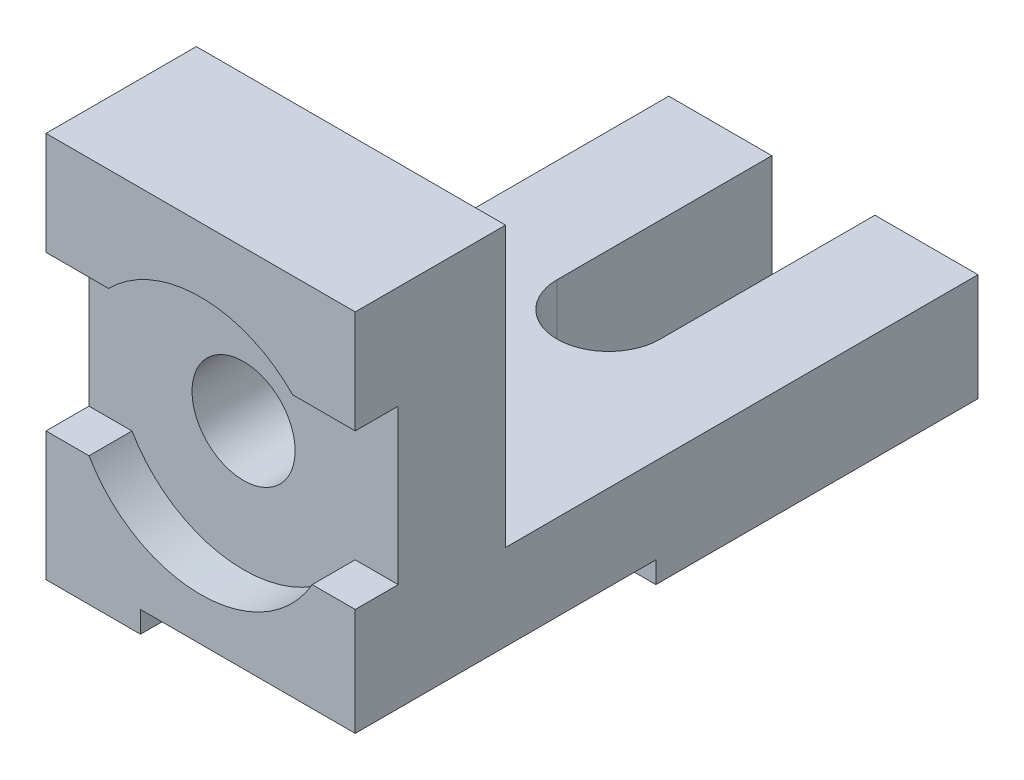
ISO-10303-21;
HEADER;
FILE_DESCRIPTION(('STEP AP214'),'2;1');
FILE_NAME('part.step','',(''),(''),'','','');
FILE_SCHEMA(('AUTOMOTIVE_DESIGN { 1 0 10303 214 1 1 1 1 }'));
ENDSEC;
DATA;
#1=APPLICATION_CONTEXT('core data for automotive mechanical design processes');
#2=APPLICATION_PROTOCOL_DEFINITION('international standard','automotive_design',2000,#1);
#3=PRODUCT_CONTEXT('',#1,'mechanical');
#4=PRODUCT('Part','Part','',(#3));
#5=PRODUCT_RELATED_PRODUCT_CATEGORY('part','',(#4));
#6=PRODUCT_DEFINITION_FORMATION('','',#4);
#7=PRODUCT_DEFINITION_CONTEXT('part definition',#1,'design');
#8=PRODUCT_DEFINITION('design','',#6,#7);
#9=PRODUCT_DEFINITION_SHAPE('','',#8);
#10=(LENGTH_UNIT() NAMED_UNIT(*) SI_UNIT(.MILLI.,.METRE.));
#11=(NAMED_UNIT(*) PLANE_ANGLE_UNIT() SI_UNIT($,.RADIAN.));
#12=(NAMED_UNIT(*) SI_UNIT($,.STERADIAN.) SOLID_ANGLE_UNIT());
#13=UNCERTAINTY_MEASURE_WITH_UNIT(LENGTH_MEASURE(1.E-05),#10,'distance_accuracy_value','');
#14=(GEOMETRIC_REPRESENTATION_CONTEXT(3) GLOBAL_UNCERTAINTY_ASSIGNED_CONTEXT((#13)) GLOBAL_UNIT_ASSIGNED_CONTEXT((#10,
#11,#12)) REPRESENTATION_CONTEXT('',''));
#15=CARTESIAN_POINT('',(0.,0.,0.));
#16=DIRECTION('',(0.,0.,1.));
#17=DIRECTION('',(1.,0.,0.));
#18=AXIS2_PLACEMENT_3D('',#15,#16,#17);
#19=CARTESIAN_POINT('',(-72.,30.,-10.));
#20=DIRECTION('',(0.,1.,0.));
#21=DIRECTION('',(0.,0.,1.));
#22=AXIS2_PLACEMENT_3D('',#19,#20,#21);
#23=PLANE('',#22);
#24=DIRECTION('',(1.,0.,0.));
#25=VECTOR('',#24,1.);
#26=CARTESIAN_POINT('',(-72.,30.,0.));
#27=LINE('',#26,#25);
#28=CARTESIAN_POINT('',(-72.,30.,0.));
#29=VERTEX_POINT('',#28);
#30=CARTESIAN_POINT('',(-61.9807621135332,30.,0.));
#31=VERTEX_POINT('',#30);
#32=EDGE_CURVE('E11',#29,#31,#27,.T.);
#33=ORIENTED_EDGE('',*,*,#32,.T.);
#34=DIRECTION('',(0.,0.,1.));
#35=VECTOR('',#34,1.);
#36=CARTESIAN_POINT('',(-61.9807621135332,30.,-94.8528137423857));
#37=LINE('',#36,#35);
#38=CARTESIAN_POINT('',(-61.9807621135332,30.,-10.));
#39=VERTEX_POINT('',#38);
#40=EDGE_CURVE('E231',#31,#39,#37,.F.);
#41=ORIENTED_EDGE('',*,*,#40,.T.);
#42=DIRECTION('',(1.,0.,0.));
#43=VECTOR('',#42,1.);
#44=CARTESIAN_POINT('',(-72.,30.,-10.));
#45=LINE('',#44,#43);
#46=CARTESIAN_POINT('',(-72.,30.,-10.));
#47=VERTEX_POINT('',#46);
#48=EDGE_CURVE('E315',#47,#39,#45,.T.);
#49=ORIENTED_EDGE('',*,*,#48,.F.);
#50=DIRECTION('',(0.,0.,1.));
#51=VECTOR('',#50,1.);
#52=CARTESIAN_POINT('',(-72.,30.,-10.));
#53=LINE('',#52,#51);
#54=EDGE_CURVE('E287',#47,#29,#53,.T.);
#55=ORIENTED_EDGE('',*,*,#54,.T.);
#56=EDGE_LOOP('',(#33,#41,#49,#55));
#57=FACE_BOUND('',#56,.T.);
#58=ADVANCED_FACE('F37',(#57),#23,.T.);
#59=CARTESIAN_POINT('',(-10.0192378864668,30.,-10.));
#60=VERTEX_POINT('',#59);
#61=CARTESIAN_POINT('',(0.,30.,-10.));
#62=VERTEX_POINT('',#61);
#63=EDGE_CURVE('E317',#60,#62,#45,.T.);
#64=ORIENTED_EDGE('',*,*,#63,.F.);
#65=DIRECTION('',(0.,0.,1.));
#66=VECTOR('',#65,1.);
#67=CARTESIAN_POINT('',(-10.0192378864668,30.,-94.8528137423857));
#68=LINE('',#67,#66);
#69=CARTESIAN_POINT('',(-10.0192378864668,30.,0.));
#70=VERTEX_POINT('',#69);
#71=EDGE_CURVE('E228',#60,#70,#68,.T.);
#72=ORIENTED_EDGE('',*,*,#71,.T.);
#73=CARTESIAN_POINT('',(0.,30.,0.));
#74=VERTEX_POINT('',#73);
#75=EDGE_CURVE('E46',#70,#74,#27,.T.);
#76=ORIENTED_EDGE('',*,*,#75,.T.);
#77=DIRECTION('',(0.,0.,1.));
#78=VECTOR('',#77,1.);
#79=CARTESIAN_POINT('',(0.,30.,-10.));
#80=LINE('',#79,#78);
#81=EDGE_CURVE('E263',#62,#74,#80,.T.);
#82=ORIENTED_EDGE('',*,*,#81,.F.);
#83=EDGE_LOOP('',(#64,#72,#76,#82));
#84=FACE_BOUND('',#83,.T.);
#85=ADVANCED_FACE('F398',(#84),#23,.T.);
#86=CARTESIAN_POINT('',(-72.,66.,0.));
#87=DIRECTION('',(0.,-1.,0.));
#88=DIRECTION('',(0.,0.,-1.));
#89=AXIS2_PLACEMENT_3D('',#86,#87,#88);
#90=PLANE('',#89);
#91=DIRECTION('',(1.,0.,0.));
#92=VECTOR('',#91,1.);
#93=CARTESIAN_POINT('',(-72.,66.,0.));
#94=LINE('',#93,#92);
#95=CARTESIAN_POINT('',(-14.5757147143714,66.,0.));
#96=VERTEX_POINT('',#95);
#97=CARTESIAN_POINT('',(0.,66.,0.));
#98=VERTEX_POINT('',#97);
#99=EDGE_CURVE('E325',#96,#98,#94,.T.);
#100=ORIENTED_EDGE('',*,*,#99,.F.);
#101=DIRECTION('',(0.,0.,1.));
#102=VECTOR('',#101,1.);
#103=CARTESIAN_POINT('',(-14.5757147143714,66.,-94.8528137423857));
#104=LINE('',#103,#102);
#105=CARTESIAN_POINT('',(-14.5757147143714,66.,-10.));
#106=VERTEX_POINT('',#105);
#107=EDGE_CURVE('E225',#96,#106,#104,.F.);
#108=ORIENTED_EDGE('',*,*,#107,.T.);
#109=DIRECTION('',(1.,0.,0.));
#110=VECTOR('',#109,1.);
#111=CARTESIAN_POINT('',(-72.,66.,-10.));
#112=LINE('',#111,#110);
#113=CARTESIAN_POINT('',(0.,66.,-10.));
#114=VERTEX_POINT('',#113);
#115=EDGE_CURVE('E321',#106,#114,#112,.T.);
#116=ORIENTED_EDGE('',*,*,#115,.T.);
#117=DIRECTION('',(0.,0.,-1.));
#118=VECTOR('',#117,1.);
#119=CARTESIAN_POINT('',(0.,66.,0.));
#120=LINE('',#119,#118);
#121=EDGE_CURVE('E308',#98,#114,#120,.T.);
#122=ORIENTED_EDGE('',*,*,#121,.F.);
#123=EDGE_LOOP('',(#100,#108,#116,#122));
#124=FACE_BOUND('',#123,.T.);
#125=ADVANCED_FACE('F390',(#124),#90,.T.);
#126=CARTESIAN_POINT('',(-72.,66.,-10.));
#127=VERTEX_POINT('',#126);
#128=CARTESIAN_POINT('',(-57.4242852856285,66.,-10.));
#129=VERTEX_POINT('',#128);
#130=EDGE_CURVE('E318',#127,#129,#112,.T.);
#131=ORIENTED_EDGE('',*,*,#130,.T.);
#132=DIRECTION('',(0.,0.,1.));
#133=VECTOR('',#132,1.);
#134=CARTESIAN_POINT('',(-57.4242852856285,66.,-94.8528137423857));
#135=LINE('',#134,#133);
#136=CARTESIAN_POINT('',(-57.4242852856285,66.,0.));
#137=VERTEX_POINT('',#136);
#138=EDGE_CURVE('E222',#129,#137,#135,.T.);
#139=ORIENTED_EDGE('',*,*,#138,.T.);
#140=CARTESIAN_POINT('',(-72.,66.,0.));
#141=VERTEX_POINT('',#140);
#142=EDGE_CURVE('E322',#141,#137,#94,.T.);
#143=ORIENTED_EDGE('',*,*,#142,.F.);
#144=DIRECTION('',(0.,0.,-1.));
#145=VECTOR('',#144,1.);
#146=CARTESIAN_POINT('',(-72.,66.,0.));
#147=LINE('',#146,#145);
#148=EDGE_CURVE('E281',#141,#127,#147,.T.);
#149=ORIENTED_EDGE('',*,*,#148,.T.);
#150=EDGE_LOOP('',(#131,#139,#143,#149));
#151=FACE_BOUND('',#150,.T.);
#152=ADVANCED_FACE('F433',(#151),#90,.T.);
#153=CARTESIAN_POINT('',(-72.,0.,-145.));
#154=DIRECTION('',(0.,0.,-1.));
#155=DIRECTION('',(-1.,0.,0.));
#156=AXIS2_PLACEMENT_3D('',#153,#154,#155);
#157=PLANE('',#156);
#158=DIRECTION('',(1.,0.,0.));
#159=VECTOR('',#158,1.);
#160=CARTESIAN_POINT('',(-72.,25.,-145.));
#161=LINE('',#160,#159);
#162=CARTESIAN_POINT('',(-72.,25.,-145.));
#163=VERTEX_POINT('',#162);
#164=CARTESIAN_POINT('',(-48.,25.,-145.));
#165=VERTEX_POINT('',#164);
#166=EDGE_CURVE('E332',#163,#165,#161,.T.);
#167=ORIENTED_EDGE('',*,*,#166,.T.);
#168=DIRECTION('',(0.,-1.,0.));
#169=VECTOR('',#168,1.);
#170=CARTESIAN_POINT('',(-48.,262.783609871224,-145.));
#171=LINE('',#170,#169);
#172=CARTESIAN_POINT('',(-48.,0.,-145.));
#173=VERTEX_POINT('',#172);
#174=EDGE_CURVE('E255',#165,#173,#171,.T.);
#175=ORIENTED_EDGE('',*,*,#174,.T.);
#176=DIRECTION('',(1.,0.,0.));
#177=VECTOR('',#176,1.);
#178=CARTESIAN_POINT('',(-72.,0.,-145.));
#179=LINE('',#178,#177);
#180=CARTESIAN_POINT('',(-72.,0.,-145.));
#181=VERTEX_POINT('',#180);
#182=EDGE_CURVE('E335',#181,#173,#179,.T.);
#183=ORIENTED_EDGE('',*,*,#182,.F.);
#184=DIRECTION('',(0.,1.,0.));
#185=VECTOR('',#184,1.);
#186=CARTESIAN_POINT('',(-72.,0.,-145.));
#187=LINE('',#186,#185);
#188=EDGE_CURVE('E266',#181,#163,#187,.T.);
#189=ORIENTED_EDGE('',*,*,#188,.T.);
#190=EDGE_LOOP('',(#167,#175,#183,#189));
#191=FACE_BOUND('',#190,.T.);
#192=ADVANCED_FACE('F356',(#191),#157,.T.);
#193=CARTESIAN_POINT('',(-72.,25.,-145.));
#194=DIRECTION('',(0.,1.,0.));
#195=DIRECTION('',(0.,0.,1.));
#196=AXIS2_PLACEMENT_3D('',#193,#194,#195);
#197=PLANE('',#196);
#198=DIRECTION('',(0.,0.,1.));
#199=VECTOR('',#198,1.);
#200=CARTESIAN_POINT('',(-48.,25.,-145.));
#201=LINE('',#200,#199);
#202=CARTESIAN_POINT('',(-48.,25.,-95.));
#203=VERTEX_POINT('',#202);
#204=EDGE_CURVE('E238',#165,#203,#201,.T.);
#205=ORIENTED_EDGE('',*,*,#204,.F.);
#206=ORIENTED_EDGE('',*,*,#166,.F.);
#207=DIRECTION('',(0.,0.,1.));
#208=VECTOR('',#207,1.);
#209=CARTESIAN_POINT('',(-72.,25.,-145.));
#210=LINE('',#209,#208);
#211=CARTESIAN_POINT('',(-72.,25.,-35.));
#212=VERTEX_POINT('',#211);
#213=EDGE_CURVE('E269',#163,#212,#210,.T.);
#214=ORIENTED_EDGE('',*,*,#213,.T.);
#215=DIRECTION('',(1.,0.,0.));
#216=VECTOR('',#215,1.);
#217=CARTESIAN_POINT('',(-72.,25.,-35.));
#218=LINE('',#217,#216);
#219=CARTESIAN_POINT('',(0.,25.,-35.));
#220=VERTEX_POINT('',#219);
#221=EDGE_CURVE('E330',#212,#220,#218,.T.);
#222=ORIENTED_EDGE('',*,*,#221,.T.);
#223=DIRECTION('',(0.,0.,1.));
#224=VECTOR('',#223,1.);
#225=CARTESIAN_POINT('',(0.,25.,-145.));
#226=LINE('',#225,#224);
#227=CARTESIAN_POINT('',(0.,25.,-145.));
#228=VERTEX_POINT('',#227);
#229=EDGE_CURVE('E296',#228,#220,#226,.T.);
#230=ORIENTED_EDGE('',*,*,#229,.F.);
#231=CARTESIAN_POINT('',(-24.,25.,-145.));
#232=VERTEX_POINT('',#231);
#233=EDGE_CURVE('E334',#232,#228,#161,.T.);
#234=ORIENTED_EDGE('',*,*,#233,.F.);
#235=DIRECTION('',(0.,0.,-1.));
#236=VECTOR('',#235,1.);
#237=CARTESIAN_POINT('',(-24.,25.,-145.));
#238=LINE('',#237,#236);
#239=CARTESIAN_POINT('',(-24.,25.,-95.));
#240=VERTEX_POINT('',#239);
#241=EDGE_CURVE('E237',#240,#232,#238,.T.);
#242=ORIENTED_EDGE('',*,*,#241,.F.);
#243=CARTESIAN_POINT('',(-36.,25.,-95.));
#244=DIRECTION('',(0.,1.,0.));
#245=DIRECTION('',(0.,0.,1.));
#246=AXIS2_PLACEMENT_3D('',#243,#244,#245);
#247=CIRCLE('',#246,12.);
#248=EDGE_CURVE('E235',#203,#240,#247,.T.);
#249=ORIENTED_EDGE('',*,*,#248,.F.);
#250=EDGE_LOOP('',(#205,#206,#214,#222,#230,#234,#242,#249));
#251=FACE_BOUND('',#250,.T.);
#252=ADVANCED_FACE('F363',(#251),#197,.T.);
#253=CARTESIAN_POINT('',(-72.,30.,0.));
#254=DIRECTION('',(0.,0.,1.));
#255=DIRECTION('',(0.,-1.,0.));
#256=AXIS2_PLACEMENT_3D('',#253,#254,#255);
#257=PLANE('',#256);
#258=DIRECTION('',(0.,-1.,0.));
#259=VECTOR('',#258,1.);
#260=CARTESIAN_POINT('',(-50.,5.,0.));
#261=LINE('',#260,#259);
#262=CARTESIAN_POINT('',(-50.,5.,0.));
#263=VERTEX_POINT('',#262);
#264=CARTESIAN_POINT('',(-50.,0.,0.));
#265=VERTEX_POINT('',#264);
#266=EDGE_CURVE('E197',#263,#265,#261,.T.);
#267=ORIENTED_EDGE('',*,*,#266,.F.);
#268=DIRECTION('',(-1.,0.,0.));
#269=VECTOR('',#268,1.);
#270=CARTESIAN_POINT('',(0.,5.,0.));
#271=LINE('',#270,#269);
#272=CARTESIAN_POINT('',(0.,5.,0.));
#273=VERTEX_POINT('',#272);
#274=EDGE_CURVE('E401',#273,#263,#271,.T.);
#275=ORIENTED_EDGE('',*,*,#274,.F.);
#276=DIRECTION('',(0.,-1.,0.));
#277=VECTOR('',#276,1.);
#278=CARTESIAN_POINT('',(0.,30.,0.));
#279=LINE('',#278,#277);
#280=EDGE_CURVE('E203',#74,#273,#279,.T.);
#281=ORIENTED_EDGE('',*,*,#280,.F.);
#282=ORIENTED_EDGE('',*,*,#75,.F.);
#283=CARTESIAN_POINT('',(-36.,45.,0.));
#284=DIRECTION('',(0.,0.,-1.));
#285=DIRECTION('',(-1.,0.,0.));
#286=AXIS2_PLACEMENT_3D('',#283,#284,#285);
#287=CIRCLE('',#286,30.);
#288=EDGE_CURVE('E216',#70,#31,#287,.T.);
#289=ORIENTED_EDGE('',*,*,#288,.T.);
#290=ORIENTED_EDGE('',*,*,#32,.F.);
#291=DIRECTION('',(0.,-1.,0.));
#292=VECTOR('',#291,1.);
#293=CARTESIAN_POINT('',(-72.,30.,0.));
#294=LINE('',#293,#292);
#295=CARTESIAN_POINT('',(-72.,0.,0.));
#296=VERTEX_POINT('',#295);
#297=EDGE_CURVE('E259',#29,#296,#294,.T.);
#298=ORIENTED_EDGE('',*,*,#297,.T.);
#299=DIRECTION('',(1.,0.,0.));
#300=VECTOR('',#299,1.);
#301=CARTESIAN_POINT('',(-72.,0.,0.));
#302=LINE('',#301,#300);
#303=EDGE_CURVE('E41',#296,#265,#302,.T.);
#304=ORIENTED_EDGE('',*,*,#303,.T.);
#305=EDGE_LOOP('',(#267,#275,#281,#282,#289,#290,#298,#304));
#306=FACE_BOUND('',#305,.T.);
#307=ADVANCED_FACE('F39',(#306),#257,.T.);
#308=CARTESIAN_POINT('',(-72.,66.,-10.));
#309=DIRECTION('',(0.,0.,1.));
#310=DIRECTION('',(0.,-1.,0.));
#311=AXIS2_PLACEMENT_3D('',#308,#309,#310);
#312=PLANE('',#311);
#313=CARTESIAN_POINT('',(-36.,45.,-10.));
#314=DIRECTION('',(0.,0.,1.));
#315=DIRECTION('',(1.,0.,0.));
#316=AXIS2_PLACEMENT_3D('',#313,#314,#315);
#317=CIRCLE('',#316,12.);
#318=CARTESIAN_POINT('',(-24.,45.,-10.));
#319=VERTEX_POINT('',#318);
#320=EDGE_CURVE('E210',#319,#319,#317,.T.);
#321=ORIENTED_EDGE('',*,*,#320,.F.);
#322=EDGE_LOOP('',(#321));
#323=FACE_BOUND('',#322,.T.);
#324=ORIENTED_EDGE('',*,*,#115,.F.);
#325=CARTESIAN_POINT('',(-36.,45.,-10.));
#326=DIRECTION('',(0.,0.,1.));
#327=DIRECTION('',(0.,-1.,0.));
#328=AXIS2_PLACEMENT_3D('',#325,#326,#327);
#329=CIRCLE('',#328,30.);
#330=EDGE_CURVE('E221',#106,#129,#329,.T.);
#331=ORIENTED_EDGE('',*,*,#330,.T.);
#332=ORIENTED_EDGE('',*,*,#130,.F.);
#333=DIRECTION('',(0.,-1.,0.));
#334=VECTOR('',#333,1.);
#335=CARTESIAN_POINT('',(-72.,66.,-10.));
#336=LINE('',#335,#334);
#337=EDGE_CURVE('E284',#127,#47,#336,.T.);
#338=ORIENTED_EDGE('',*,*,#337,.T.);
#339=ORIENTED_EDGE('',*,*,#48,.T.);
#340=EDGE_CURVE('E62',#39,#60,#329,.T.);
#341=ORIENTED_EDGE('',*,*,#340,.T.);
#342=ORIENTED_EDGE('',*,*,#63,.T.);
#343=DIRECTION('',(0.,-1.,0.));
#344=VECTOR('',#343,1.);
#345=CARTESIAN_POINT('',(0.,66.,-10.));
#346=LINE('',#345,#344);
#347=EDGE_CURVE('E311',#114,#62,#346,.T.);
#348=ORIENTED_EDGE('',*,*,#347,.F.);
#349=EDGE_LOOP('',(#324,#331,#332,#338,#339,#341,#342,#348));
#350=FACE_BOUND('',#349,.T.);
#351=ADVANCED_FACE('F394',(#323,#350),#312,.T.);
#352=CARTESIAN_POINT('',(-72.,90.,0.));
#353=DIRECTION('',(0.,0.,1.));
#354=DIRECTION('',(0.,-1.,0.));
#355=AXIS2_PLACEMENT_3D('',#352,#353,#354);
#356=PLANE('',#355);
#357=ORIENTED_EDGE('',*,*,#142,.T.);
#358=EDGE_CURVE('E217',#137,#96,#287,.T.);
#359=ORIENTED_EDGE('',*,*,#358,.T.);
#360=ORIENTED_EDGE('',*,*,#99,.T.);
#361=DIRECTION('',(0.,-1.,0.));
#362=VECTOR('',#361,1.);
#363=CARTESIAN_POINT('',(0.,90.,0.));
#364=LINE('',#363,#362);
#365=CARTESIAN_POINT('',(0.,90.,0.));
#366=VERTEX_POINT('',#365);
#367=EDGE_CURVE('E305',#366,#98,#364,.T.);
#368=ORIENTED_EDGE('',*,*,#367,.F.);
#369=DIRECTION('',(1.,0.,0.));
#370=VECTOR('',#369,1.);
#371=CARTESIAN_POINT('',(-72.,90.,0.));
#372=LINE('',#371,#370);
#373=CARTESIAN_POINT('',(-72.,90.,0.));
#374=VERTEX_POINT('',#373);
#375=EDGE_CURVE('E326',#374,#366,#372,.T.);
#376=ORIENTED_EDGE('',*,*,#375,.F.);
#377=DIRECTION('',(0.,-1.,0.));
#378=VECTOR('',#377,1.);
#379=CARTESIAN_POINT('',(-72.,90.,0.));
#380=LINE('',#379,#378);
#381=EDGE_CURVE('E278',#374,#141,#380,.T.);
#382=ORIENTED_EDGE('',*,*,#381,.T.);
#383=EDGE_LOOP('',(#357,#359,#360,#368,#376,#382));
#384=FACE_BOUND('',#383,.T.);
#385=ADVANCED_FACE('F386',(#384),#356,.T.);
#386=CARTESIAN_POINT('',(-72.,90.,-35.));
#387=DIRECTION('',(0.,1.,0.));
#388=DIRECTION('',(0.,0.,1.));
#389=AXIS2_PLACEMENT_3D('',#386,#387,#388);
#390=PLANE('',#389);
#391=DIRECTION('',(0.,0.,1.));
#392=VECTOR('',#391,1.);
#393=CARTESIAN_POINT('',(0.,90.,-35.));
#394=LINE('',#393,#392);
#395=CARTESIAN_POINT('',(0.,90.,-35.));
#396=VERTEX_POINT('',#395);
#397=EDGE_CURVE('E302',#396,#366,#394,.T.);
#398=ORIENTED_EDGE('',*,*,#397,.F.);
#399=DIRECTION('',(1.,0.,0.));
#400=VECTOR('',#399,1.);
#401=CARTESIAN_POINT('',(-72.,90.,-35.));
#402=LINE('',#401,#400);
#403=CARTESIAN_POINT('',(-72.,90.,-35.));
#404=VERTEX_POINT('',#403);
#405=EDGE_CURVE('E328',#404,#396,#402,.T.);
#406=ORIENTED_EDGE('',*,*,#405,.F.);
#407=DIRECTION('',(0.,0.,1.));
#408=VECTOR('',#407,1.);
#409=CARTESIAN_POINT('',(-72.,90.,-35.));
#410=LINE('',#409,#408);
#411=EDGE_CURVE('E275',#404,#374,#410,.T.);
#412=ORIENTED_EDGE('',*,*,#411,.T.);
#413=ORIENTED_EDGE('',*,*,#375,.T.);
#414=EDGE_LOOP('',(#398,#406,#412,#413));
#415=FACE_BOUND('',#414,.T.);
#416=ADVANCED_FACE('F382',(#415),#390,.T.);
#417=CARTESIAN_POINT('',(-72.,25.,-35.));
#418=DIRECTION('',(0.,0.,-1.));
#419=DIRECTION('',(-1.,0.,0.));
#420=AXIS2_PLACEMENT_3D('',#417,#418,#419);
#421=PLANE('',#420);
#422=CARTESIAN_POINT('',(-36.,45.,-35.));
#423=DIRECTION('',(0.,0.,-1.));
#424=DIRECTION('',(-1.,0.,0.));
#425=AXIS2_PLACEMENT_3D('',#422,#423,#424);
#426=CIRCLE('',#425,12.);
#427=CARTESIAN_POINT('',(-48.,45.,-35.));
#428=VERTEX_POINT('',#427);
#429=EDGE_CURVE('E213',#428,#428,#426,.F.);
#430=ORIENTED_EDGE('',*,*,#429,.T.);
#431=EDGE_LOOP('',(#430));
#432=FACE_BOUND('',#431,.T.);
#433=DIRECTION('',(0.,1.,0.));
#434=VECTOR('',#433,1.);
#435=CARTESIAN_POINT('',(0.,25.,-35.));
#436=LINE('',#435,#434);
#437=EDGE_CURVE('E299',#220,#396,#436,.T.);
#438=ORIENTED_EDGE('',*,*,#437,.F.);
#439=ORIENTED_EDGE('',*,*,#221,.F.);
#440=DIRECTION('',(0.,1.,0.));
#441=VECTOR('',#440,1.);
#442=CARTESIAN_POINT('',(-72.,25.,-35.));
#443=LINE('',#442,#441);
#444=EDGE_CURVE('E272',#212,#404,#443,.T.);
#445=ORIENTED_EDGE('',*,*,#444,.T.);
#446=ORIENTED_EDGE('',*,*,#405,.T.);
#447=EDGE_LOOP('',(#438,#439,#445,#446));
#448=FACE_BOUND('',#447,.T.);
#449=ADVANCED_FACE('F378',(#432,#448),#421,.T.);
#450=DIRECTION('',(0.,-1.,0.));
#451=VECTOR('',#450,1.);
#452=CARTESIAN_POINT('',(-24.,262.783609871224,-145.));
#453=LINE('',#452,#451);
#454=CARTESIAN_POINT('',(-24.,0.,-145.));
#455=VERTEX_POINT('',#454);
#456=EDGE_CURVE('E248',#232,#455,#453,.T.);
#457=ORIENTED_EDGE('',*,*,#456,.F.);
#458=ORIENTED_EDGE('',*,*,#233,.T.);
#459=DIRECTION('',(0.,1.,0.));
#460=VECTOR('',#459,1.);
#461=CARTESIAN_POINT('',(0.,0.,-145.));
#462=LINE('',#461,#460);
#463=CARTESIAN_POINT('',(0.,0.,-145.));
#464=VERTEX_POINT('',#463);
#465=EDGE_CURVE('E293',#464,#228,#462,.T.);
#466=ORIENTED_EDGE('',*,*,#465,.F.);
#467=EDGE_CURVE('E337',#455,#464,#179,.T.);
#468=ORIENTED_EDGE('',*,*,#467,.F.);
#469=EDGE_LOOP('',(#457,#458,#466,#468));
#470=FACE_BOUND('',#469,.T.);
#471=ADVANCED_FACE('F374',(#470),#157,.T.);
#472=CARTESIAN_POINT('',(-72.,0.,0.));
#473=DIRECTION('',(0.,-1.,0.));
#474=DIRECTION('',(0.,0.,-1.));
#475=AXIS2_PLACEMENT_3D('',#472,#473,#474);
#476=PLANE('',#475);
#477=DIRECTION('',(0.,0.,1.));
#478=VECTOR('',#477,1.);
#479=CARTESIAN_POINT('',(-50.,0.,-70.));
#480=LINE('',#479,#478);
#481=CARTESIAN_POINT('',(-50.,0.,-70.));
#482=VERTEX_POINT('',#481);
#483=EDGE_CURVE('E205',#482,#265,#480,.T.);
#484=ORIENTED_EDGE('',*,*,#483,.T.);
#485=ORIENTED_EDGE('',*,*,#303,.F.);
#486=DIRECTION('',(0.,0.,-1.));
#487=VECTOR('',#486,1.);
#488=CARTESIAN_POINT('',(-72.,0.,0.));
#489=LINE('',#488,#487);
#490=EDGE_CURVE('E262',#296,#181,#489,.T.);
#491=ORIENTED_EDGE('',*,*,#490,.T.);
#492=ORIENTED_EDGE('',*,*,#182,.T.);
#493=DIRECTION('',(0.,0.,1.));
#494=VECTOR('',#493,1.);
#495=CARTESIAN_POINT('',(-48.,0.,-145.));
#496=LINE('',#495,#494);
#497=CARTESIAN_POINT('',(-48.,0.,-95.));
#498=VERTEX_POINT('',#497);
#499=EDGE_CURVE('E245',#173,#498,#496,.T.);
#500=ORIENTED_EDGE('',*,*,#499,.T.);
#501=CARTESIAN_POINT('',(-36.,0.,-95.));
#502=DIRECTION('',(0.,1.,0.));
#503=DIRECTION('',(0.,0.,1.));
#504=AXIS2_PLACEMENT_3D('',#501,#502,#503);
#505=CIRCLE('',#504,12.);
#506=CARTESIAN_POINT('',(-24.,0.,-95.));
#507=VERTEX_POINT('',#506);
#508=EDGE_CURVE('E242',#498,#507,#505,.T.);
#509=ORIENTED_EDGE('',*,*,#508,.T.);
#510=DIRECTION('',(0.,0.,-1.));
#511=VECTOR('',#510,1.);
#512=CARTESIAN_POINT('',(-24.,0.,-145.));
#513=LINE('',#512,#511);
#514=EDGE_CURVE('E234',#507,#455,#513,.T.);
#515=ORIENTED_EDGE('',*,*,#514,.T.);
#516=ORIENTED_EDGE('',*,*,#467,.T.);
#517=DIRECTION('',(0.,0.,-1.));
#518=VECTOR('',#517,1.);
#519=CARTESIAN_POINT('',(0.,0.,0.));
#520=LINE('',#519,#518);
#521=CARTESIAN_POINT('',(0.,0.,-70.));
#522=VERTEX_POINT('',#521);
#523=EDGE_CURVE('E291',#522,#464,#520,.T.);
#524=ORIENTED_EDGE('',*,*,#523,.F.);
#525=DIRECTION('',(1.,0.,0.));
#526=VECTOR('',#525,1.);
#527=CARTESIAN_POINT('',(-50.,0.,-70.));
#528=LINE('',#527,#526);
#529=EDGE_CURVE('E54',#482,#522,#528,.T.);
#530=ORIENTED_EDGE('',*,*,#529,.F.);
#531=EDGE_LOOP('',(#484,#485,#491,#492,#500,#509,#515,#516,#524,#530));
#532=FACE_BOUND('',#531,.T.);
#533=ADVANCED_FACE('F348',(#532),#476,.T.);
#534=CARTESIAN_POINT('',(-72.,0.,0.));
#535=DIRECTION('',(1.,0.,0.));
#536=DIRECTION('',(0.,0.,-1.));
#537=AXIS2_PLACEMENT_3D('',#534,#535,#536);
#538=PLANE('',#537);
#539=ORIENTED_EDGE('',*,*,#297,.F.);
#540=ORIENTED_EDGE('',*,*,#54,.F.);
#541=ORIENTED_EDGE('',*,*,#337,.F.);
#542=ORIENTED_EDGE('',*,*,#148,.F.);
#543=ORIENTED_EDGE('',*,*,#381,.F.);
#544=ORIENTED_EDGE('',*,*,#411,.F.);
#545=ORIENTED_EDGE('',*,*,#444,.F.);
#546=ORIENTED_EDGE('',*,*,#213,.F.);
#547=ORIENTED_EDGE('',*,*,#188,.F.);
#548=ORIENTED_EDGE('',*,*,#490,.F.);
#549=EDGE_LOOP('',(#539,#540,#541,#542,#543,#544,#545,#546,#547,#548));
#550=FACE_BOUND('',#549,.T.);
#551=ADVANCED_FACE('F351',(#550),#538,.F.);
#552=CARTESIAN_POINT('',(0.,0.,0.));
#553=DIRECTION('',(1.,0.,0.));
#554=DIRECTION('',(0.,0.,-1.));
#555=AXIS2_PLACEMENT_3D('',#552,#553,#554);
#556=PLANE('',#555);
#557=DIRECTION('',(0.,0.,1.));
#558=VECTOR('',#557,1.);
#559=CARTESIAN_POINT('',(0.,5.,-70.));
#560=LINE('',#559,#558);
#561=CARTESIAN_POINT('',(0.,5.,-70.));
#562=VERTEX_POINT('',#561);
#563=EDGE_CURVE('E187',#562,#273,#560,.T.);
#564=ORIENTED_EDGE('',*,*,#563,.F.);
#565=DIRECTION('',(0.,1.,0.));
#566=VECTOR('',#565,1.);
#567=CARTESIAN_POINT('',(0.,0.,-70.));
#568=LINE('',#567,#566);
#569=EDGE_CURVE('E192',#522,#562,#568,.T.);
#570=ORIENTED_EDGE('',*,*,#569,.F.);
#571=ORIENTED_EDGE('',*,*,#523,.T.);
#572=ORIENTED_EDGE('',*,*,#465,.T.);
#573=ORIENTED_EDGE('',*,*,#229,.T.);
#574=ORIENTED_EDGE('',*,*,#437,.T.);
#575=ORIENTED_EDGE('',*,*,#397,.T.);
#576=ORIENTED_EDGE('',*,*,#367,.T.);
#577=ORIENTED_EDGE('',*,*,#121,.T.);
#578=ORIENTED_EDGE('',*,*,#347,.T.);
#579=ORIENTED_EDGE('',*,*,#81,.T.);
#580=ORIENTED_EDGE('',*,*,#280,.T.);
#581=EDGE_LOOP('',(#564,#570,#571,#572,#573,#574,#575,#576,#577,#578,#579,#580));
#582=FACE_BOUND('',#581,.T.);
#583=ADVANCED_FACE('F200',(#582),#556,.T.);
#584=CARTESIAN_POINT('',(-48.,262.783609871224,-145.));
#585=DIRECTION('',(1.,0.,0.));
#586=DIRECTION('',(0.,0.,-1.));
#587=AXIS2_PLACEMENT_3D('',#584,#585,#586);
#588=PLANE('',#587);
#589=ORIENTED_EDGE('',*,*,#174,.F.);
#590=ORIENTED_EDGE('',*,*,#204,.T.);
#591=DIRECTION('',(0.,-1.,0.));
#592=VECTOR('',#591,1.);
#593=CARTESIAN_POINT('',(-48.,262.783609871224,-95.));
#594=LINE('',#593,#592);
#595=EDGE_CURVE('E252',#203,#498,#594,.T.);
#596=ORIENTED_EDGE('',*,*,#595,.T.);
#597=ORIENTED_EDGE('',*,*,#499,.F.);
#598=EDGE_LOOP('',(#589,#590,#596,#597));
#599=FACE_BOUND('',#598,.T.);
#600=ADVANCED_FACE('F359',(#599),#588,.T.);
#601=CARTESIAN_POINT('',(-36.,262.783609871224,-95.));
#602=DIRECTION('',(0.,-1.,0.));
#603=DIRECTION('',(0.,0.,-1.));
#604=AXIS2_PLACEMENT_3D('',#601,#602,#603);
#605=CYLINDRICAL_SURFACE('',#604,12.);
#606=ORIENTED_EDGE('',*,*,#595,.F.);
#607=ORIENTED_EDGE('',*,*,#248,.T.);
#608=DIRECTION('',(0.,-1.,0.));
#609=VECTOR('',#608,1.);
#610=CARTESIAN_POINT('',(-24.,262.783609871224,-95.));
#611=LINE('',#610,#609);
#612=EDGE_CURVE('E250',#240,#507,#611,.T.);
#613=ORIENTED_EDGE('',*,*,#612,.T.);
#614=ORIENTED_EDGE('',*,*,#508,.F.);
#615=EDGE_LOOP('',(#606,#607,#613,#614));
#616=FACE_BOUND('',#615,.T.);
#617=ADVANCED_FACE('F368',(#616),#605,.F.);
#618=CARTESIAN_POINT('',(-24.,262.783609871224,-145.));
#619=DIRECTION('',(-1.,0.,0.));
#620=DIRECTION('',(0.,0.,1.));
#621=AXIS2_PLACEMENT_3D('',#618,#619,#620);
#622=PLANE('',#621);
#623=ORIENTED_EDGE('',*,*,#612,.F.);
#624=ORIENTED_EDGE('',*,*,#241,.T.);
#625=ORIENTED_EDGE('',*,*,#456,.T.);
#626=ORIENTED_EDGE('',*,*,#514,.F.);
#627=EDGE_LOOP('',(#623,#624,#625,#626));
#628=FACE_BOUND('',#627,.T.);
#629=ADVANCED_FACE('F371',(#628),#622,.T.);
#630=CARTESIAN_POINT('',(-36.,45.,-94.8528137423857));
#631=DIRECTION('',(0.,0.,1.));
#632=DIRECTION('',(1.,0.,0.));
#633=AXIS2_PLACEMENT_3D('',#630,#631,#632);
#634=CYLINDRICAL_SURFACE('',#633,30.);
#635=ORIENTED_EDGE('',*,*,#358,.F.);
#636=ORIENTED_EDGE('',*,*,#138,.F.);
#637=ORIENTED_EDGE('',*,*,#330,.F.);
#638=ORIENTED_EDGE('',*,*,#107,.F.);
#639=EDGE_LOOP('',(#635,#636,#637,#638));
#640=FACE_BOUND('',#639,.T.);
#641=ADVANCED_FACE('F454',(#640),#634,.F.);
#642=ORIENTED_EDGE('',*,*,#288,.F.);
#643=ORIENTED_EDGE('',*,*,#71,.F.);
#644=ORIENTED_EDGE('',*,*,#340,.F.);
#645=ORIENTED_EDGE('',*,*,#40,.F.);
#646=EDGE_LOOP('',(#642,#643,#644,#645));
#647=FACE_BOUND('',#646,.T.);
#648=ADVANCED_FACE('F415',(#647),#634,.F.);
#649=CARTESIAN_POINT('',(-36.,45.,-68.9411254969543));
#650=DIRECTION('',(0.,0.,1.));
#651=DIRECTION('',(1.,0.,0.));
#652=AXIS2_PLACEMENT_3D('',#649,#650,#651);
#653=CYLINDRICAL_SURFACE('',#652,12.);
#654=ORIENTED_EDGE('',*,*,#320,.T.);
#655=EDGE_LOOP('',(#654));
#656=FACE_BOUND('',#655,.T.);
#657=ORIENTED_EDGE('',*,*,#429,.F.);
#658=EDGE_LOOP('',(#657));
#659=FACE_BOUND('',#658,.T.);
#660=ADVANCED_FACE('F408',(#656,#659),#653,.F.);
#661=CARTESIAN_POINT('',(-50.,5.,-70.));
#662=DIRECTION('',(-1.,0.,0.));
#663=DIRECTION('',(0.,0.,1.));
#664=AXIS2_PLACEMENT_3D('',#661,#662,#663);
#665=PLANE('',#664);
#666=ORIENTED_EDGE('',*,*,#266,.T.);
#667=ORIENTED_EDGE('',*,*,#483,.F.);
#668=DIRECTION('',(0.,-1.,0.));
#669=VECTOR('',#668,1.);
#670=CARTESIAN_POINT('',(-50.,5.,-70.));
#671=LINE('',#670,#669);
#672=CARTESIAN_POINT('',(-50.,5.,-70.));
#673=VERTEX_POINT('',#672);
#674=EDGE_CURVE('E191',#673,#482,#671,.T.);
#675=ORIENTED_EDGE('',*,*,#674,.F.);
#676=DIRECTION('',(0.,0.,1.));
#677=VECTOR('',#676,1.);
#678=CARTESIAN_POINT('',(-50.,5.,-70.));
#679=LINE('',#678,#677);
#680=EDGE_CURVE('E189',#673,#263,#679,.T.);
#681=ORIENTED_EDGE('',*,*,#680,.T.);
#682=EDGE_LOOP('',(#666,#667,#675,#681));
#683=FACE_BOUND('',#682,.T.);
#684=ADVANCED_FACE('F406',(#683),#665,.F.);
#685=CARTESIAN_POINT('',(0.,5.,-70.));
#686=DIRECTION('',(0.,1.,0.));
#687=DIRECTION('',(-1.,0.,0.));
#688=AXIS2_PLACEMENT_3D('',#685,#686,#687);
#689=PLANE('',#688);
#690=ORIENTED_EDGE('',*,*,#274,.T.);
#691=ORIENTED_EDGE('',*,*,#680,.F.);
#692=DIRECTION('',(-1.,0.,0.));
#693=VECTOR('',#692,1.);
#694=CARTESIAN_POINT('',(0.,5.,-70.));
#695=LINE('',#694,#693);
#696=EDGE_CURVE('E183',#562,#673,#695,.T.);
#697=ORIENTED_EDGE('',*,*,#696,.F.);
#698=ORIENTED_EDGE('',*,*,#563,.T.);
#699=EDGE_LOOP('',(#690,#691,#697,#698));
#700=FACE_BOUND('',#699,.T.);
#701=ADVANCED_FACE('F185',(#700),#689,.F.);
#702=CARTESIAN_POINT('',(0.,0.,-70.));
#703=DIRECTION('',(0.,0.,1.));
#704=DIRECTION('',(1.,0.,0.));
#705=AXIS2_PLACEMENT_3D('',#702,#703,#704);
#706=PLANE('',#705);
#707=ORIENTED_EDGE('',*,*,#569,.T.);
#708=ORIENTED_EDGE('',*,*,#696,.T.);
#709=ORIENTED_EDGE('',*,*,#674,.T.);
#710=ORIENTED_EDGE('',*,*,#529,.T.);
#711=EDGE_LOOP('',(#707,#708,#709,#710));
#712=FACE_BOUND('',#711,.T.);
#713=ADVANCED_FACE('F194',(#712),#706,.T.);
#714=CLOSED_SHELL('',(#58,#85,#125,#152,#192,#252,#307,#351,#385,#416,#449,#471,#533,#551,#583,
#600,#617,#629,#641,#648,#660,#684,#701,#713));
#715=MANIFOLD_SOLID_BREP('B2',#714);
#716=ADVANCED_BREP_SHAPE_REPRESENTATION('',(#18,#715),#14);
#717=SHAPE_DEFINITION_REPRESENTATION(#9,#716);
ENDSEC;
END-ISO-10303-21;
